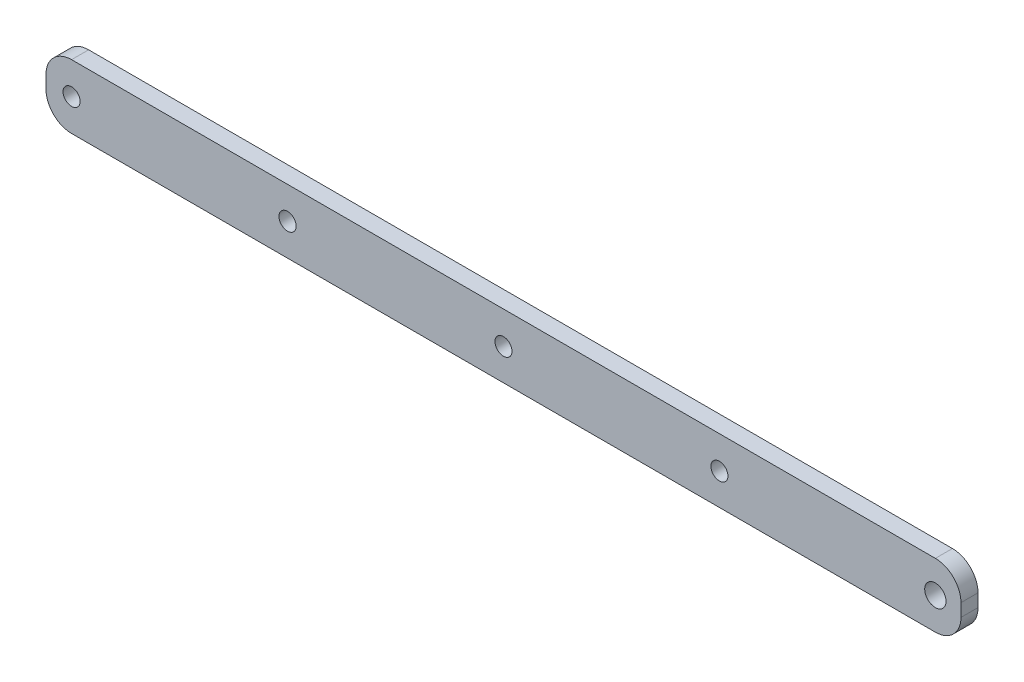
ISO-10303-21;
HEADER;
FILE_DESCRIPTION(('STEP AP214'),'2;1');
FILE_NAME('part.step','',(''),(''),'','','');
FILE_SCHEMA(('AUTOMOTIVE_DESIGN { 1 0 10303 214 1 1 1 1 }'));
ENDSEC;
DATA;
#1=APPLICATION_CONTEXT('core data for automotive mechanical design processes');
#2=APPLICATION_PROTOCOL_DEFINITION('international standard','automotive_design',2000,#1);
#3=PRODUCT_CONTEXT('',#1,'mechanical');
#4=PRODUCT('Part','Part','',(#3));
#5=PRODUCT_RELATED_PRODUCT_CATEGORY('part','',(#4));
#6=PRODUCT_DEFINITION_FORMATION('','',#4);
#7=PRODUCT_DEFINITION_CONTEXT('part definition',#1,'design');
#8=PRODUCT_DEFINITION('design','',#6,#7);
#9=PRODUCT_DEFINITION_SHAPE('','',#8);
#10=(LENGTH_UNIT() NAMED_UNIT(*) SI_UNIT(.MILLI.,.METRE.));
#11=(NAMED_UNIT(*) PLANE_ANGLE_UNIT() SI_UNIT($,.RADIAN.));
#12=(NAMED_UNIT(*) SI_UNIT($,.STERADIAN.) SOLID_ANGLE_UNIT());
#13=UNCERTAINTY_MEASURE_WITH_UNIT(LENGTH_MEASURE(1.E-05),#10,'distance_accuracy_value','');
#14=(GEOMETRIC_REPRESENTATION_CONTEXT(3) GLOBAL_UNCERTAINTY_ASSIGNED_CONTEXT((#13)) GLOBAL_UNIT_ASSIGNED_CONTEXT((#10,
#11,#12)) REPRESENTATION_CONTEXT('',''));
#15=CARTESIAN_POINT('',(0.,0.,0.));
#16=DIRECTION('',(0.,0.,1.));
#17=DIRECTION('',(1.,0.,0.));
#18=AXIS2_PLACEMENT_3D('',#15,#16,#17);
#19=CARTESIAN_POINT('',(264.922,7.62,5.08));
#20=DIRECTION('',(0.,0.,1.));
#21=DIRECTION('',(1.,0.,0.));
#22=AXIS2_PLACEMENT_3D('',#19,#20,#21);
#23=PLANE('',#22);
#24=CARTESIAN_POINT('',(136.271,9.398,5.08));
#25=DIRECTION('',(0.,0.,1.));
#26=DIRECTION('',(1.,0.,0.));
#27=AXIS2_PLACEMENT_3D('',#24,#25,#26);
#28=CIRCLE('',#27,2.53999999999998);
#29=CARTESIAN_POINT('',(138.811,9.398,5.08));
#30=VERTEX_POINT('',#29);
#31=EDGE_CURVE('E199',#30,#30,#28,.T.);
#32=ORIENTED_EDGE('',*,*,#31,.F.);
#33=EDGE_LOOP('',(#32));
#34=FACE_BOUND('',#33,.T.);
#35=CARTESIAN_POINT('',(7.62,9.525,5.08));
#36=DIRECTION('',(0.,0.,1.));
#37=DIRECTION('',(1.,0.,0.));
#38=AXIS2_PLACEMENT_3D('',#35,#36,#37);
#39=CIRCLE('',#38,2.54);
#40=CARTESIAN_POINT('',(10.16,9.525,5.08));
#41=VERTEX_POINT('',#40);
#42=EDGE_CURVE('E187',#41,#41,#39,.T.);
#43=ORIENTED_EDGE('',*,*,#42,.F.);
#44=EDGE_LOOP('',(#43));
#45=FACE_BOUND('',#44,.T.);
#46=CARTESIAN_POINT('',(264.922,7.62,5.08));
#47=DIRECTION('',(0.,0.,1.));
#48=DIRECTION('',(1.,0.,0.));
#49=AXIS2_PLACEMENT_3D('',#46,#47,#48);
#50=CIRCLE('',#49,7.62000000000003);
#51=CARTESIAN_POINT('',(264.922,0.,5.08));
#52=VERTEX_POINT('',#51);
#53=CARTESIAN_POINT('',(272.542,7.62,5.08));
#54=VERTEX_POINT('',#53);
#55=EDGE_CURVE('E150',#52,#54,#50,.T.);
#56=ORIENTED_EDGE('',*,*,#55,.T.);
#57=DIRECTION('',(0.,1.,0.));
#58=VECTOR('',#57,1.);
#59=CARTESIAN_POINT('',(272.542,7.62,5.08));
#60=LINE('',#59,#58);
#61=CARTESIAN_POINT('',(272.542,11.43,5.08));
#62=VERTEX_POINT('',#61);
#63=EDGE_CURVE('E98',#54,#62,#60,.T.);
#64=ORIENTED_EDGE('',*,*,#63,.T.);
#65=CARTESIAN_POINT('',(264.922,11.43,5.08));
#66=DIRECTION('',(0.,0.,1.));
#67=DIRECTION('',(-1.,0.,0.));
#68=AXIS2_PLACEMENT_3D('',#65,#66,#67);
#69=CIRCLE('',#68,7.62000000000003);
#70=CARTESIAN_POINT('',(264.922,19.05,5.08));
#71=VERTEX_POINT('',#70);
#72=EDGE_CURVE('E165',#62,#71,#69,.T.);
#73=ORIENTED_EDGE('',*,*,#72,.T.);
#74=DIRECTION('',(-1.,0.,0.));
#75=VECTOR('',#74,1.);
#76=CARTESIAN_POINT('',(7.62000000000005,19.05,5.08));
#77=LINE('',#76,#75);
#78=CARTESIAN_POINT('',(7.62000000000005,19.05,5.08));
#79=VERTEX_POINT('',#78);
#80=EDGE_CURVE('E178',#71,#79,#77,.T.);
#81=ORIENTED_EDGE('',*,*,#80,.T.);
#82=CARTESIAN_POINT('',(7.62,11.43,5.08));
#83=DIRECTION('',(0.,0.,1.));
#84=DIRECTION('',(-1.,0.,0.));
#85=AXIS2_PLACEMENT_3D('',#82,#83,#84);
#86=CIRCLE('',#85,7.62);
#87=CARTESIAN_POINT('',(0.,11.4299999999999,5.08));
#88=VERTEX_POINT('',#87);
#89=EDGE_CURVE('E117',#79,#88,#86,.T.);
#90=ORIENTED_EDGE('',*,*,#89,.T.);
#91=DIRECTION('',(0.,-1.,0.));
#92=VECTOR('',#91,1.);
#93=CARTESIAN_POINT('',(0.,7.62000000000005,5.08));
#94=LINE('',#93,#92);
#95=CARTESIAN_POINT('',(0.,7.62,5.08));
#96=VERTEX_POINT('',#95);
#97=EDGE_CURVE('E111',#88,#96,#94,.T.);
#98=ORIENTED_EDGE('',*,*,#97,.T.);
#99=CARTESIAN_POINT('',(7.62,7.62,5.08));
#100=DIRECTION('',(0.,0.,1.));
#101=DIRECTION('',(-1.,0.,0.));
#102=AXIS2_PLACEMENT_3D('',#99,#100,#101);
#103=CIRCLE('',#102,7.62);
#104=CARTESIAN_POINT('',(7.62000000000005,0.,5.08));
#105=VERTEX_POINT('',#104);
#106=EDGE_CURVE('E115',#96,#105,#103,.T.);
#107=ORIENTED_EDGE('',*,*,#106,.T.);
#108=DIRECTION('',(1.,0.,0.));
#109=VECTOR('',#108,1.);
#110=CARTESIAN_POINT('',(7.62000000000005,0.,5.08));
#111=LINE('',#110,#109);
#112=EDGE_CURVE('E55',#105,#52,#111,.T.);
#113=ORIENTED_EDGE('',*,*,#112,.T.);
#114=EDGE_LOOP('',(#56,#64,#73,#81,#90,#98,#107,#113));
#115=FACE_BOUND('',#114,.T.);
#116=CARTESIAN_POINT('',(264.922,9.525,5.08));
#117=DIRECTION('',(0.,0.,1.));
#118=DIRECTION('',(1.,0.,0.));
#119=AXIS2_PLACEMENT_3D('',#116,#117,#118);
#120=CIRCLE('',#119,3.17499999999997);
#121=CARTESIAN_POINT('',(268.097,9.525,5.08));
#122=VERTEX_POINT('',#121);
#123=EDGE_CURVE('E139',#122,#122,#120,.T.);
#124=ORIENTED_EDGE('',*,*,#123,.F.);
#125=EDGE_LOOP('',(#124));
#126=FACE_BOUND('',#125,.T.);
#127=CARTESIAN_POINT('',(71.9455,9.525,5.08));
#128=DIRECTION('',(0.,0.,1.));
#129=DIRECTION('',(1.,0.,0.));
#130=AXIS2_PLACEMENT_3D('',#127,#128,#129);
#131=CIRCLE('',#130,2.55864583742352);
#132=CARTESIAN_POINT('',(74.5041458374235,9.525,5.08));
#133=VERTEX_POINT('',#132);
#134=EDGE_CURVE('E193',#133,#133,#131,.T.);
#135=ORIENTED_EDGE('',*,*,#134,.F.);
#136=EDGE_LOOP('',(#135));
#137=FACE_BOUND('',#136,.T.);
#138=CARTESIAN_POINT('',(200.5965,9.398,5.08));
#139=DIRECTION('',(0.,0.,1.));
#140=DIRECTION('',(1.,0.,0.));
#141=AXIS2_PLACEMENT_3D('',#138,#139,#140);
#142=CIRCLE('',#141,2.53999999999998);
#143=CARTESIAN_POINT('',(203.1365,9.398,5.08));
#144=VERTEX_POINT('',#143);
#145=EDGE_CURVE('E205',#144,#144,#142,.T.);
#146=ORIENTED_EDGE('',*,*,#145,.F.);
#147=EDGE_LOOP('',(#146));
#148=FACE_BOUND('',#147,.T.);
#149=ADVANCED_FACE('F38',(#34,#45,#115,#126,#137,#148),#23,.T.);
#150=CARTESIAN_POINT('',(264.922,7.62,0.));
#151=DIRECTION('',(0.,0.,1.));
#152=DIRECTION('',(1.,0.,0.));
#153=AXIS2_PLACEMENT_3D('',#150,#151,#152);
#154=PLANE('',#153);
#155=CARTESIAN_POINT('',(264.922,7.62,0.));
#156=DIRECTION('',(0.,0.,1.));
#157=DIRECTION('',(1.,0.,0.));
#158=AXIS2_PLACEMENT_3D('',#155,#156,#157);
#159=CIRCLE('',#158,7.62000000000003);
#160=CARTESIAN_POINT('',(264.922,0.,0.));
#161=VERTEX_POINT('',#160);
#162=CARTESIAN_POINT('',(272.542,7.62,0.));
#163=VERTEX_POINT('',#162);
#164=EDGE_CURVE('E135',#161,#163,#159,.T.);
#165=ORIENTED_EDGE('',*,*,#164,.F.);
#166=DIRECTION('',(1.,0.,0.));
#167=VECTOR('',#166,1.);
#168=CARTESIAN_POINT('',(7.62000000000005,0.,0.));
#169=LINE('',#168,#167);
#170=CARTESIAN_POINT('',(7.62000000000005,0.,0.));
#171=VERTEX_POINT('',#170);
#172=EDGE_CURVE('E90',#171,#161,#169,.T.);
#173=ORIENTED_EDGE('',*,*,#172,.F.);
#174=CARTESIAN_POINT('',(7.62,7.62,0.));
#175=DIRECTION('',(0.,0.,1.));
#176=DIRECTION('',(-1.,0.,0.));
#177=AXIS2_PLACEMENT_3D('',#174,#175,#176);
#178=CIRCLE('',#177,7.62);
#179=CARTESIAN_POINT('',(0.,7.62,0.));
#180=VERTEX_POINT('',#179);
#181=EDGE_CURVE('E84',#180,#171,#178,.T.);
#182=ORIENTED_EDGE('',*,*,#181,.F.);
#183=DIRECTION('',(0.,-1.,0.));
#184=VECTOR('',#183,1.);
#185=CARTESIAN_POINT('',(0.,7.62000000000005,0.));
#186=LINE('',#185,#184);
#187=CARTESIAN_POINT('',(0.,11.4299999999999,0.));
#188=VERTEX_POINT('',#187);
#189=EDGE_CURVE('E125',#188,#180,#186,.T.);
#190=ORIENTED_EDGE('',*,*,#189,.F.);
#191=CARTESIAN_POINT('',(7.62,11.43,0.));
#192=DIRECTION('',(0.,0.,1.));
#193=DIRECTION('',(-1.,0.,0.));
#194=AXIS2_PLACEMENT_3D('',#191,#192,#193);
#195=CIRCLE('',#194,7.62);
#196=CARTESIAN_POINT('',(7.62000000000005,19.05,0.));
#197=VERTEX_POINT('',#196);
#198=EDGE_CURVE('E145',#197,#188,#195,.T.);
#199=ORIENTED_EDGE('',*,*,#198,.F.);
#200=DIRECTION('',(-1.,0.,0.));
#201=VECTOR('',#200,1.);
#202=CARTESIAN_POINT('',(7.62000000000005,19.05,0.));
#203=LINE('',#202,#201);
#204=CARTESIAN_POINT('',(264.922,19.05,0.));
#205=VERTEX_POINT('',#204);
#206=EDGE_CURVE('E143',#205,#197,#203,.T.);
#207=ORIENTED_EDGE('',*,*,#206,.F.);
#208=CARTESIAN_POINT('',(264.922,11.43,0.));
#209=DIRECTION('',(0.,0.,1.));
#210=DIRECTION('',(-1.,0.,0.));
#211=AXIS2_PLACEMENT_3D('',#208,#209,#210);
#212=CIRCLE('',#211,7.62000000000003);
#213=CARTESIAN_POINT('',(272.542,11.43,0.));
#214=VERTEX_POINT('',#213);
#215=EDGE_CURVE('E141',#214,#205,#212,.T.);
#216=ORIENTED_EDGE('',*,*,#215,.F.);
#217=DIRECTION('',(0.,1.,0.));
#218=VECTOR('',#217,1.);
#219=CARTESIAN_POINT('',(272.542,7.62,0.));
#220=LINE('',#219,#218);
#221=EDGE_CURVE('E138',#163,#214,#220,.T.);
#222=ORIENTED_EDGE('',*,*,#221,.F.);
#223=EDGE_LOOP('',(#165,#173,#182,#190,#199,#207,#216,#222));
#224=FACE_BOUND('',#223,.T.);
#225=CARTESIAN_POINT('',(264.922,9.525,0.));
#226=DIRECTION('',(0.,0.,1.));
#227=DIRECTION('',(1.,0.,0.));
#228=AXIS2_PLACEMENT_3D('',#225,#226,#227);
#229=CIRCLE('',#228,3.17499999999997);
#230=CARTESIAN_POINT('',(268.097,9.525,0.));
#231=VERTEX_POINT('',#230);
#232=EDGE_CURVE('E184',#231,#231,#229,.T.);
#233=ORIENTED_EDGE('',*,*,#232,.T.);
#234=EDGE_LOOP('',(#233));
#235=FACE_BOUND('',#234,.T.);
#236=CARTESIAN_POINT('',(7.62,9.525,0.));
#237=DIRECTION('',(0.,0.,1.));
#238=DIRECTION('',(1.,0.,0.));
#239=AXIS2_PLACEMENT_3D('',#236,#237,#238);
#240=CIRCLE('',#239,2.54);
#241=CARTESIAN_POINT('',(10.16,9.525,0.));
#242=VERTEX_POINT('',#241);
#243=EDGE_CURVE('E190',#242,#242,#240,.T.);
#244=ORIENTED_EDGE('',*,*,#243,.T.);
#245=EDGE_LOOP('',(#244));
#246=FACE_BOUND('',#245,.T.);
#247=CARTESIAN_POINT('',(71.9455,9.525,0.));
#248=DIRECTION('',(0.,0.,1.));
#249=DIRECTION('',(1.,0.,0.));
#250=AXIS2_PLACEMENT_3D('',#247,#248,#249);
#251=CIRCLE('',#250,2.55864583742352);
#252=CARTESIAN_POINT('',(74.5041458374235,9.525,0.));
#253=VERTEX_POINT('',#252);
#254=EDGE_CURVE('E196',#253,#253,#251,.T.);
#255=ORIENTED_EDGE('',*,*,#254,.T.);
#256=EDGE_LOOP('',(#255));
#257=FACE_BOUND('',#256,.T.);
#258=CARTESIAN_POINT('',(136.271,9.398,0.));
#259=DIRECTION('',(0.,0.,1.));
#260=DIRECTION('',(1.,0.,0.));
#261=AXIS2_PLACEMENT_3D('',#258,#259,#260);
#262=CIRCLE('',#261,2.53999999999998);
#263=CARTESIAN_POINT('',(138.811,9.398,0.));
#264=VERTEX_POINT('',#263);
#265=EDGE_CURVE('E202',#264,#264,#262,.T.);
#266=ORIENTED_EDGE('',*,*,#265,.T.);
#267=EDGE_LOOP('',(#266));
#268=FACE_BOUND('',#267,.T.);
#269=CARTESIAN_POINT('',(200.5965,9.398,0.));
#270=DIRECTION('',(0.,0.,1.));
#271=DIRECTION('',(1.,0.,0.));
#272=AXIS2_PLACEMENT_3D('',#269,#270,#271);
#273=CIRCLE('',#272,2.53999999999998);
#274=CARTESIAN_POINT('',(203.1365,9.398,0.));
#275=VERTEX_POINT('',#274);
#276=EDGE_CURVE('E208',#275,#275,#273,.T.);
#277=ORIENTED_EDGE('',*,*,#276,.T.);
#278=EDGE_LOOP('',(#277));
#279=FACE_BOUND('',#278,.T.);
#280=ADVANCED_FACE('F169',(#224,#235,#246,#257,#268,#279),#154,.F.);
#281=CARTESIAN_POINT('',(264.922,7.62,5.08));
#282=DIRECTION('',(0.,0.,-1.));
#283=DIRECTION('',(-1.,0.,0.));
#284=AXIS2_PLACEMENT_3D('',#281,#282,#283);
#285=CYLINDRICAL_SURFACE('',#284,7.62000000000003);
#286=ORIENTED_EDGE('',*,*,#164,.T.);
#287=DIRECTION('',(0.,0.,-1.));
#288=VECTOR('',#287,1.);
#289=CARTESIAN_POINT('',(272.542,7.62,5.08));
#290=LINE('',#289,#288);
#291=EDGE_CURVE('E11',#54,#163,#290,.T.);
#292=ORIENTED_EDGE('',*,*,#291,.F.);
#293=ORIENTED_EDGE('',*,*,#55,.F.);
#294=DIRECTION('',(0.,0.,-1.));
#295=VECTOR('',#294,1.);
#296=CARTESIAN_POINT('',(264.922,0.,5.08));
#297=LINE('',#296,#295);
#298=EDGE_CURVE('E131',#52,#161,#297,.T.);
#299=ORIENTED_EDGE('',*,*,#298,.T.);
#300=EDGE_LOOP('',(#286,#292,#293,#299));
#301=FACE_BOUND('',#300,.T.);
#302=ADVANCED_FACE('F40',(#301),#285,.T.);
#303=CARTESIAN_POINT('',(272.542,7.62,5.08));
#304=DIRECTION('',(-1.,0.,0.));
#305=DIRECTION('',(0.,0.,1.));
#306=AXIS2_PLACEMENT_3D('',#303,#304,#305);
#307=PLANE('',#306);
#308=ORIENTED_EDGE('',*,*,#221,.T.);
#309=DIRECTION('',(0.,0.,-1.));
#310=VECTOR('',#309,1.);
#311=CARTESIAN_POINT('',(272.542,11.43,5.08));
#312=LINE('',#311,#310);
#313=EDGE_CURVE('E47',#62,#214,#312,.T.);
#314=ORIENTED_EDGE('',*,*,#313,.F.);
#315=ORIENTED_EDGE('',*,*,#63,.F.);
#316=ORIENTED_EDGE('',*,*,#291,.T.);
#317=EDGE_LOOP('',(#308,#314,#315,#316));
#318=FACE_BOUND('',#317,.T.);
#319=ADVANCED_FACE('F242',(#318),#307,.F.);
#320=CARTESIAN_POINT('',(264.922,11.43,5.08));
#321=DIRECTION('',(0.,0.,-1.));
#322=DIRECTION('',(-1.,0.,0.));
#323=AXIS2_PLACEMENT_3D('',#320,#321,#322);
#324=CYLINDRICAL_SURFACE('',#323,7.62000000000003);
#325=ORIENTED_EDGE('',*,*,#215,.T.);
#326=DIRECTION('',(0.,0.,-1.));
#327=VECTOR('',#326,1.);
#328=CARTESIAN_POINT('',(264.922,19.05,5.08));
#329=LINE('',#328,#327);
#330=EDGE_CURVE('E157',#71,#205,#329,.T.);
#331=ORIENTED_EDGE('',*,*,#330,.F.);
#332=ORIENTED_EDGE('',*,*,#72,.F.);
#333=ORIENTED_EDGE('',*,*,#313,.T.);
#334=EDGE_LOOP('',(#325,#331,#332,#333));
#335=FACE_BOUND('',#334,.T.);
#336=ADVANCED_FACE('F163',(#335),#324,.T.);
#337=CARTESIAN_POINT('',(7.62000000000005,19.05,5.08));
#338=DIRECTION('',(0.,-1.,0.));
#339=DIRECTION('',(1.,0.,0.));
#340=AXIS2_PLACEMENT_3D('',#337,#338,#339);
#341=PLANE('',#340);
#342=ORIENTED_EDGE('',*,*,#206,.T.);
#343=DIRECTION('',(0.,0.,-1.));
#344=VECTOR('',#343,1.);
#345=CARTESIAN_POINT('',(7.62000000000005,19.05,5.08));
#346=LINE('',#345,#344);
#347=EDGE_CURVE('E154',#79,#197,#346,.T.);
#348=ORIENTED_EDGE('',*,*,#347,.F.);
#349=ORIENTED_EDGE('',*,*,#80,.F.);
#350=ORIENTED_EDGE('',*,*,#330,.T.);
#351=EDGE_LOOP('',(#342,#348,#349,#350));
#352=FACE_BOUND('',#351,.T.);
#353=ADVANCED_FACE('F174',(#352),#341,.F.);
#354=CARTESIAN_POINT('',(7.62,11.43,5.08));
#355=DIRECTION('',(0.,0.,-1.));
#356=DIRECTION('',(-1.,0.,0.));
#357=AXIS2_PLACEMENT_3D('',#354,#355,#356);
#358=CYLINDRICAL_SURFACE('',#357,7.62);
#359=ORIENTED_EDGE('',*,*,#198,.T.);
#360=DIRECTION('',(0.,0.,-1.));
#361=VECTOR('',#360,1.);
#362=CARTESIAN_POINT('',(0.,11.4299999999999,5.08));
#363=LINE('',#362,#361);
#364=EDGE_CURVE('E126',#88,#188,#363,.T.);
#365=ORIENTED_EDGE('',*,*,#364,.F.);
#366=ORIENTED_EDGE('',*,*,#89,.F.);
#367=ORIENTED_EDGE('',*,*,#347,.T.);
#368=EDGE_LOOP('',(#359,#365,#366,#367));
#369=FACE_BOUND('',#368,.T.);
#370=ADVANCED_FACE('F177',(#369),#358,.T.);
#371=CARTESIAN_POINT('',(0.,7.62000000000005,5.08));
#372=DIRECTION('',(1.,0.,0.));
#373=DIRECTION('',(0.,0.,-1.));
#374=AXIS2_PLACEMENT_3D('',#371,#372,#373);
#375=PLANE('',#374);
#376=ORIENTED_EDGE('',*,*,#189,.T.);
#377=DIRECTION('',(0.,0.,-1.));
#378=VECTOR('',#377,1.);
#379=CARTESIAN_POINT('',(0.,7.62,5.08));
#380=LINE('',#379,#378);
#381=EDGE_CURVE('E122',#96,#180,#380,.T.);
#382=ORIENTED_EDGE('',*,*,#381,.F.);
#383=ORIENTED_EDGE('',*,*,#97,.F.);
#384=ORIENTED_EDGE('',*,*,#364,.T.);
#385=EDGE_LOOP('',(#376,#382,#383,#384));
#386=FACE_BOUND('',#385,.T.);
#387=ADVANCED_FACE('F123',(#386),#375,.F.);
#388=CARTESIAN_POINT('',(7.62,7.62,5.08));
#389=DIRECTION('',(0.,0.,-1.));
#390=DIRECTION('',(-1.,0.,0.));
#391=AXIS2_PLACEMENT_3D('',#388,#389,#390);
#392=CYLINDRICAL_SURFACE('',#391,7.62);
#393=ORIENTED_EDGE('',*,*,#181,.T.);
#394=DIRECTION('',(0.,0.,-1.));
#395=VECTOR('',#394,1.);
#396=CARTESIAN_POINT('',(7.62000000000005,0.,5.08));
#397=LINE('',#396,#395);
#398=EDGE_CURVE('E127',#105,#171,#397,.T.);
#399=ORIENTED_EDGE('',*,*,#398,.F.);
#400=ORIENTED_EDGE('',*,*,#106,.F.);
#401=ORIENTED_EDGE('',*,*,#381,.T.);
#402=EDGE_LOOP('',(#393,#399,#400,#401));
#403=FACE_BOUND('',#402,.T.);
#404=ADVANCED_FACE('F129',(#403),#392,.T.);
#405=CARTESIAN_POINT('',(7.62000000000005,0.,5.08));
#406=DIRECTION('',(0.,1.,0.));
#407=DIRECTION('',(0.,0.,1.));
#408=AXIS2_PLACEMENT_3D('',#405,#406,#407);
#409=PLANE('',#408);
#410=ORIENTED_EDGE('',*,*,#172,.T.);
#411=ORIENTED_EDGE('',*,*,#298,.F.);
#412=ORIENTED_EDGE('',*,*,#112,.F.);
#413=ORIENTED_EDGE('',*,*,#398,.T.);
#414=EDGE_LOOP('',(#410,#411,#412,#413));
#415=FACE_BOUND('',#414,.T.);
#416=ADVANCED_FACE('F230',(#415),#409,.F.);
#417=CARTESIAN_POINT('',(264.922,9.525,5.08));
#418=DIRECTION('',(0.,0.,-1.));
#419=DIRECTION('',(-1.,0.,0.));
#420=AXIS2_PLACEMENT_3D('',#417,#418,#419);
#421=CYLINDRICAL_SURFACE('',#420,3.17499999999997);
#422=ORIENTED_EDGE('',*,*,#123,.T.);
#423=EDGE_LOOP('',(#422));
#424=FACE_BOUND('',#423,.T.);
#425=ORIENTED_EDGE('',*,*,#232,.F.);
#426=EDGE_LOOP('',(#425));
#427=FACE_BOUND('',#426,.T.);
#428=ADVANCED_FACE('F227',(#424,#427),#421,.F.);
#429=CARTESIAN_POINT('',(7.62,9.525,5.08));
#430=DIRECTION('',(0.,0.,-1.));
#431=DIRECTION('',(-1.,0.,0.));
#432=AXIS2_PLACEMENT_3D('',#429,#430,#431);
#433=CYLINDRICAL_SURFACE('',#432,2.54);
#434=ORIENTED_EDGE('',*,*,#42,.T.);
#435=EDGE_LOOP('',(#434));
#436=FACE_BOUND('',#435,.T.);
#437=ORIENTED_EDGE('',*,*,#243,.F.);
#438=EDGE_LOOP('',(#437));
#439=FACE_BOUND('',#438,.T.);
#440=ADVANCED_FACE('F306',(#436,#439),#433,.F.);
#441=CARTESIAN_POINT('',(71.9455,9.525,5.08));
#442=DIRECTION('',(0.,0.,-1.));
#443=DIRECTION('',(-1.,0.,0.));
#444=AXIS2_PLACEMENT_3D('',#441,#442,#443);
#445=CYLINDRICAL_SURFACE('',#444,2.55864583742352);
#446=ORIENTED_EDGE('',*,*,#134,.T.);
#447=EDGE_LOOP('',(#446));
#448=FACE_BOUND('',#447,.T.);
#449=ORIENTED_EDGE('',*,*,#254,.F.);
#450=EDGE_LOOP('',(#449));
#451=FACE_BOUND('',#450,.T.);
#452=ADVANCED_FACE('F314',(#448,#451),#445,.F.);
#453=CARTESIAN_POINT('',(136.271,9.398,5.08));
#454=DIRECTION('',(0.,0.,-1.));
#455=DIRECTION('',(-1.,0.,0.));
#456=AXIS2_PLACEMENT_3D('',#453,#454,#455);
#457=CYLINDRICAL_SURFACE('',#456,2.53999999999998);
#458=ORIENTED_EDGE('',*,*,#31,.T.);
#459=EDGE_LOOP('',(#458));
#460=FACE_BOUND('',#459,.T.);
#461=ORIENTED_EDGE('',*,*,#265,.F.);
#462=EDGE_LOOP('',(#461));
#463=FACE_BOUND('',#462,.T.);
#464=ADVANCED_FACE('F322',(#460,#463),#457,.F.);
#465=CARTESIAN_POINT('',(200.5965,9.398,5.08));
#466=DIRECTION('',(0.,0.,-1.));
#467=DIRECTION('',(-1.,0.,0.));
#468=AXIS2_PLACEMENT_3D('',#465,#466,#467);
#469=CYLINDRICAL_SURFACE('',#468,2.53999999999998);
#470=ORIENTED_EDGE('',*,*,#145,.T.);
#471=EDGE_LOOP('',(#470));
#472=FACE_BOUND('',#471,.T.);
#473=ORIENTED_EDGE('',*,*,#276,.F.);
#474=EDGE_LOOP('',(#473));
#475=FACE_BOUND('',#474,.T.);
#476=ADVANCED_FACE('F214',(#472,#475),#469,.F.);
#477=CLOSED_SHELL('',(#149,#280,#302,#319,#336,#353,#370,#387,#404,#416,#428,#440,#452,#464,#476));
#478=MANIFOLD_SOLID_BREP('B2',#477);
#479=ADVANCED_BREP_SHAPE_REPRESENTATION('',(#18,#478),#14);
#480=SHAPE_DEFINITION_REPRESENTATION(#9,#479);
ENDSEC;
END-ISO-10303-21;
